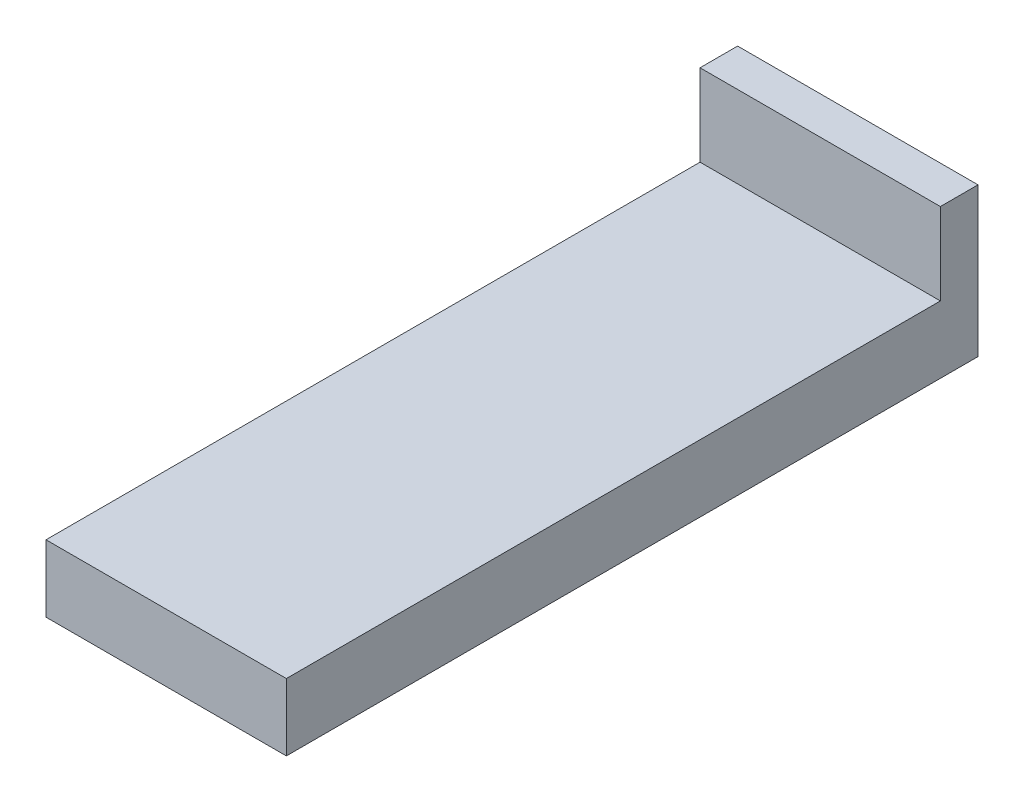
ISO-10303-21;
HEADER;
FILE_DESCRIPTION(('STEP AP214'),'2;1');
FILE_NAME('part.step','',(''),(''),'','','');
FILE_SCHEMA(('AUTOMOTIVE_DESIGN { 1 0 10303 214 1 1 1 1 }'));
ENDSEC;
DATA;
#1=APPLICATION_CONTEXT('core data for automotive mechanical design processes');
#2=APPLICATION_PROTOCOL_DEFINITION('international standard','automotive_design',2000,#1);
#3=PRODUCT_CONTEXT('',#1,'mechanical');
#4=PRODUCT('Part','Part','',(#3));
#5=PRODUCT_RELATED_PRODUCT_CATEGORY('part','',(#4));
#6=PRODUCT_DEFINITION_FORMATION('','',#4);
#7=PRODUCT_DEFINITION_CONTEXT('part definition',#1,'design');
#8=PRODUCT_DEFINITION('design','',#6,#7);
#9=PRODUCT_DEFINITION_SHAPE('','',#8);
#10=(LENGTH_UNIT() NAMED_UNIT(*) SI_UNIT(.MILLI.,.METRE.));
#11=(NAMED_UNIT(*) PLANE_ANGLE_UNIT() SI_UNIT($,.RADIAN.));
#12=(NAMED_UNIT(*) SI_UNIT($,.STERADIAN.) SOLID_ANGLE_UNIT());
#13=UNCERTAINTY_MEASURE_WITH_UNIT(LENGTH_MEASURE(1.E-05),#10,'distance_accuracy_value','');
#14=(GEOMETRIC_REPRESENTATION_CONTEXT(3) GLOBAL_UNCERTAINTY_ASSIGNED_CONTEXT((#13)) GLOBAL_UNIT_ASSIGNED_CONTEXT((#10,
#11,#12)) REPRESENTATION_CONTEXT('',''));
#15=CARTESIAN_POINT('',(0.,0.,0.));
#16=DIRECTION('',(0.,0.,1.));
#17=DIRECTION('',(1.,0.,0.));
#18=AXIS2_PLACEMENT_3D('',#15,#16,#17);
#19=CARTESIAN_POINT('',(-51.4318431092955,10.414,-40.4542084168337));
#20=DIRECTION('',(1.,0.,0.));
#21=DIRECTION('',(0.,0.,-1.));
#22=AXIS2_PLACEMENT_3D('',#19,#20,#21);
#23=PLANE('',#22);
#24=DIRECTION('',(0.,0.,1.));
#25=VECTOR('',#24,1.);
#26=CARTESIAN_POINT('',(-51.4318431092955,0.,-40.4542084168337));
#27=LINE('',#26,#25);
#28=CARTESIAN_POINT('',(-51.4318431092955,0.,-46.2962084168337));
#29=VERTEX_POINT('',#28);
#30=CARTESIAN_POINT('',(-51.4318431092955,0.,61.1457915831663));
#31=VERTEX_POINT('',#30);
#32=EDGE_CURVE('E95',#29,#31,#27,.T.);
#33=ORIENTED_EDGE('',*,*,#32,.T.);
#34=DIRECTION('',(0.,-1.,0.));
#35=VECTOR('',#34,1.);
#36=CARTESIAN_POINT('',(-51.4318431092955,10.414,61.1457915831663));
#37=LINE('',#36,#35);
#38=CARTESIAN_POINT('',(-51.4318431092955,10.414,61.1457915831663));
#39=VERTEX_POINT('',#38);
#40=EDGE_CURVE('E11',#39,#31,#37,.T.);
#41=ORIENTED_EDGE('',*,*,#40,.F.);
#42=DIRECTION('',(0.,0.,1.));
#43=VECTOR('',#42,1.);
#44=CARTESIAN_POINT('',(-51.4318431092955,10.414,-40.4542084168337));
#45=LINE('',#44,#43);
#46=CARTESIAN_POINT('',(-51.4318431092955,10.414,-40.4542084168337));
#47=VERTEX_POINT('',#46);
#48=EDGE_CURVE('E87',#47,#39,#45,.T.);
#49=ORIENTED_EDGE('',*,*,#48,.F.);
#50=DIRECTION('',(0.,1.,0.));
#51=VECTOR('',#50,1.);
#52=CARTESIAN_POINT('',(-51.4318431092955,0.,-40.4542084168337));
#53=LINE('',#52,#51);
#54=CARTESIAN_POINT('',(-51.4318431092955,23.114,-40.4542084168337));
#55=VERTEX_POINT('',#54);
#56=EDGE_CURVE('E49',#47,#55,#53,.T.);
#57=ORIENTED_EDGE('',*,*,#56,.T.);
#58=DIRECTION('',(0.,0.,1.));
#59=VECTOR('',#58,1.);
#60=CARTESIAN_POINT('',(-51.4318431092955,23.114,-46.2962084168337));
#61=LINE('',#60,#59);
#62=CARTESIAN_POINT('',(-51.4318431092955,23.114,-46.2962084168337));
#63=VERTEX_POINT('',#62);
#64=EDGE_CURVE('E102',#63,#55,#61,.T.);
#65=ORIENTED_EDGE('',*,*,#64,.F.);
#66=DIRECTION('',(0.,1.,0.));
#67=VECTOR('',#66,1.);
#68=CARTESIAN_POINT('',(-51.4318431092955,0.,-46.2962084168337));
#69=LINE('',#68,#67);
#70=EDGE_CURVE('E99',#29,#63,#69,.T.);
#71=ORIENTED_EDGE('',*,*,#70,.F.);
#72=EDGE_LOOP('',(#33,#41,#49,#57,#65,#71));
#73=FACE_BOUND('',#72,.T.);
#74=ADVANCED_FACE('F31',(#73),#23,.F.);
#75=CARTESIAN_POINT('',(-51.4318431092955,10.414,61.1457915831663));
#76=DIRECTION('',(0.,0.,-1.));
#77=DIRECTION('',(-1.,0.,0.));
#78=AXIS2_PLACEMENT_3D('',#75,#76,#77);
#79=PLANE('',#78);
#80=DIRECTION('',(1.,0.,0.));
#81=VECTOR('',#80,1.);
#82=CARTESIAN_POINT('',(-51.4318431092955,0.,61.1457915831663));
#83=LINE('',#82,#81);
#84=CARTESIAN_POINT('',(-14.0938431092955,0.,61.1457915831663));
#85=VERTEX_POINT('',#84);
#86=EDGE_CURVE('E62',#31,#85,#83,.T.);
#87=ORIENTED_EDGE('',*,*,#86,.T.);
#88=DIRECTION('',(0.,-1.,0.));
#89=VECTOR('',#88,1.);
#90=CARTESIAN_POINT('',(-14.0938431092955,10.414,61.1457915831663));
#91=LINE('',#90,#89);
#92=CARTESIAN_POINT('',(-14.0938431092955,10.414,61.1457915831663));
#93=VERTEX_POINT('',#92);
#94=EDGE_CURVE('E40',#93,#85,#91,.T.);
#95=ORIENTED_EDGE('',*,*,#94,.F.);
#96=DIRECTION('',(1.,0.,0.));
#97=VECTOR('',#96,1.);
#98=CARTESIAN_POINT('',(-51.4318431092955,10.414,61.1457915831663));
#99=LINE('',#98,#97);
#100=EDGE_CURVE('E77',#39,#93,#99,.T.);
#101=ORIENTED_EDGE('',*,*,#100,.F.);
#102=ORIENTED_EDGE('',*,*,#40,.T.);
#103=EDGE_LOOP('',(#87,#95,#101,#102));
#104=FACE_BOUND('',#103,.T.);
#105=ADVANCED_FACE('F79',(#104),#79,.F.);
#106=CARTESIAN_POINT('',(-14.0938431092955,10.414,-40.4542084168337));
#107=DIRECTION('',(-1.,0.,0.));
#108=DIRECTION('',(0.,0.,1.));
#109=AXIS2_PLACEMENT_3D('',#106,#107,#108);
#110=PLANE('',#109);
#111=DIRECTION('',(0.,0.,-1.));
#112=VECTOR('',#111,1.);
#113=CARTESIAN_POINT('',(-14.0938431092955,0.,-40.4542084168337));
#114=LINE('',#113,#112);
#115=CARTESIAN_POINT('',(-14.0938431092955,0.,-46.2962084168337));
#116=VERTEX_POINT('',#115);
#117=EDGE_CURVE('E92',#85,#116,#114,.T.);
#118=ORIENTED_EDGE('',*,*,#117,.T.);
#119=DIRECTION('',(0.,-1.,0.));
#120=VECTOR('',#119,1.);
#121=CARTESIAN_POINT('',(-14.0938431092955,0.,-46.2962084168337));
#122=LINE('',#121,#120);
#123=CARTESIAN_POINT('',(-14.0938431092955,23.114,-46.2962084168337));
#124=VERTEX_POINT('',#123);
#125=EDGE_CURVE('E135',#124,#116,#122,.T.);
#126=ORIENTED_EDGE('',*,*,#125,.F.);
#127=DIRECTION('',(0.,0.,1.));
#128=VECTOR('',#127,1.);
#129=CARTESIAN_POINT('',(-14.0938431092955,23.114,-46.2962084168337));
#130=LINE('',#129,#128);
#131=CARTESIAN_POINT('',(-14.0938431092955,23.114,-40.4542084168337));
#132=VERTEX_POINT('',#131);
#133=EDGE_CURVE('E106',#124,#132,#130,.T.);
#134=ORIENTED_EDGE('',*,*,#133,.T.);
#135=DIRECTION('',(0.,-1.,0.));
#136=VECTOR('',#135,1.);
#137=CARTESIAN_POINT('',(-14.0938431092955,0.,-40.4542084168337));
#138=LINE('',#137,#136);
#139=CARTESIAN_POINT('',(-14.0938431092955,10.414,-40.4542084168337));
#140=VERTEX_POINT('',#139);
#141=EDGE_CURVE('E119',#132,#140,#138,.T.);
#142=ORIENTED_EDGE('',*,*,#141,.T.);
#143=DIRECTION('',(0.,0.,-1.));
#144=VECTOR('',#143,1.);
#145=CARTESIAN_POINT('',(-14.0938431092955,10.414,-40.4542084168337));
#146=LINE('',#145,#144);
#147=EDGE_CURVE('E86',#93,#140,#146,.T.);
#148=ORIENTED_EDGE('',*,*,#147,.F.);
#149=ORIENTED_EDGE('',*,*,#94,.T.);
#150=EDGE_LOOP('',(#118,#126,#134,#142,#148,#149));
#151=FACE_BOUND('',#150,.T.);
#152=ADVANCED_FACE('F117',(#151),#110,.F.);
#153=CARTESIAN_POINT('',(-51.4318431092955,10.414,61.1457915831663));
#154=DIRECTION('',(0.,1.,0.));
#155=DIRECTION('',(0.,0.,1.));
#156=AXIS2_PLACEMENT_3D('',#153,#154,#155);
#157=PLANE('',#156);
#158=ORIENTED_EDGE('',*,*,#48,.T.);
#159=ORIENTED_EDGE('',*,*,#100,.T.);
#160=ORIENTED_EDGE('',*,*,#147,.T.);
#161=DIRECTION('',(-1.,0.,0.));
#162=VECTOR('',#161,1.);
#163=CARTESIAN_POINT('',(-51.4318431092955,10.414,-40.4542084168337));
#164=LINE('',#163,#162);
#165=EDGE_CURVE('E66',#140,#47,#164,.T.);
#166=ORIENTED_EDGE('',*,*,#165,.T.);
#167=EDGE_LOOP('',(#158,#159,#160,#166));
#168=FACE_BOUND('',#167,.T.);
#169=ADVANCED_FACE('F90',(#168),#157,.T.);
#170=CARTESIAN_POINT('',(-51.4318431092955,0.,61.1457915831663));
#171=DIRECTION('',(0.,1.,0.));
#172=DIRECTION('',(0.,0.,1.));
#173=AXIS2_PLACEMENT_3D('',#170,#171,#172);
#174=PLANE('',#173);
#175=ORIENTED_EDGE('',*,*,#32,.F.);
#176=DIRECTION('',(-1.,0.,0.));
#177=VECTOR('',#176,1.);
#178=CARTESIAN_POINT('',(-14.0938431092955,0.,-46.2962084168337));
#179=LINE('',#178,#177);
#180=EDGE_CURVE('E139',#116,#29,#179,.T.);
#181=ORIENTED_EDGE('',*,*,#180,.F.);
#182=ORIENTED_EDGE('',*,*,#117,.F.);
#183=ORIENTED_EDGE('',*,*,#86,.F.);
#184=EDGE_LOOP('',(#175,#181,#182,#183));
#185=FACE_BOUND('',#184,.T.);
#186=ADVANCED_FACE('F145',(#185),#174,.F.);
#187=CARTESIAN_POINT('',(-14.0938431092955,23.114,-40.4542084168337));
#188=DIRECTION('',(0.,0.,1.));
#189=DIRECTION('',(1.,0.,0.));
#190=AXIS2_PLACEMENT_3D('',#187,#188,#189);
#191=PLANE('',#190);
#192=ORIENTED_EDGE('',*,*,#165,.F.);
#193=ORIENTED_EDGE('',*,*,#141,.F.);
#194=DIRECTION('',(1.,0.,0.));
#195=VECTOR('',#194,1.);
#196=CARTESIAN_POINT('',(-14.0938431092955,23.114,-40.4542084168337));
#197=LINE('',#196,#195);
#198=EDGE_CURVE('E123',#55,#132,#197,.T.);
#199=ORIENTED_EDGE('',*,*,#198,.F.);
#200=ORIENTED_EDGE('',*,*,#56,.F.);
#201=EDGE_LOOP('',(#192,#193,#199,#200));
#202=FACE_BOUND('',#201,.T.);
#203=ADVANCED_FACE('F147',(#202),#191,.T.);
#204=CARTESIAN_POINT('',(-14.0938431092955,23.114,-46.2962084168337));
#205=DIRECTION('',(0.,-1.,0.));
#206=DIRECTION('',(0.,0.,-1.));
#207=AXIS2_PLACEMENT_3D('',#204,#205,#206);
#208=PLANE('',#207);
#209=ORIENTED_EDGE('',*,*,#198,.T.);
#210=ORIENTED_EDGE('',*,*,#133,.F.);
#211=DIRECTION('',(1.,0.,0.));
#212=VECTOR('',#211,1.);
#213=CARTESIAN_POINT('',(-14.0938431092955,23.114,-46.2962084168337));
#214=LINE('',#213,#212);
#215=EDGE_CURVE('E130',#63,#124,#214,.T.);
#216=ORIENTED_EDGE('',*,*,#215,.F.);
#217=ORIENTED_EDGE('',*,*,#64,.T.);
#218=EDGE_LOOP('',(#209,#210,#216,#217));
#219=FACE_BOUND('',#218,.T.);
#220=ADVANCED_FACE('F153',(#219),#208,.F.);
#221=CARTESIAN_POINT('',(-14.0938431092955,23.114,-46.2962084168337));
#222=DIRECTION('',(0.,0.,1.));
#223=DIRECTION('',(1.,0.,0.));
#224=AXIS2_PLACEMENT_3D('',#221,#222,#223);
#225=PLANE('',#224);
#226=ORIENTED_EDGE('',*,*,#125,.T.);
#227=ORIENTED_EDGE('',*,*,#180,.T.);
#228=ORIENTED_EDGE('',*,*,#70,.T.);
#229=ORIENTED_EDGE('',*,*,#215,.T.);
#230=EDGE_LOOP('',(#226,#227,#228,#229));
#231=FACE_BOUND('',#230,.T.);
#232=ADVANCED_FACE('F143',(#231),#225,.F.);
#233=CLOSED_SHELL('',(#74,#105,#152,#169,#186,#203,#220,#232));
#234=MANIFOLD_SOLID_BREP('B2',#233);
#235=ADVANCED_BREP_SHAPE_REPRESENTATION('',(#18,#234),#14);
#236=SHAPE_DEFINITION_REPRESENTATION(#9,#235);
ENDSEC;
END-ISO-10303-21;
